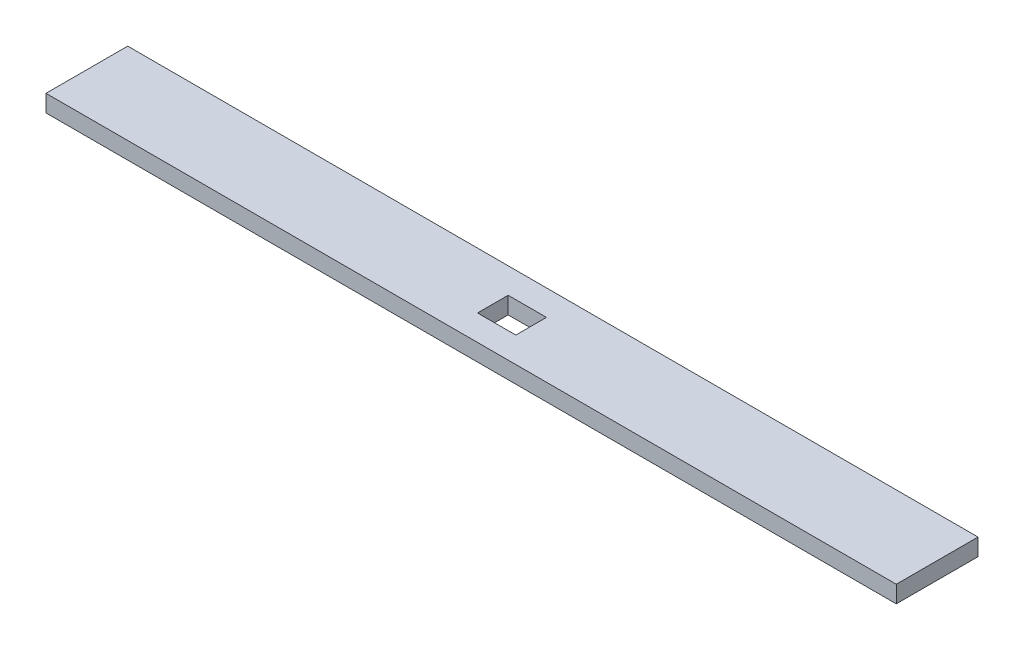
ISO-10303-21;
HEADER;
FILE_DESCRIPTION(('STEP AP214'),'2;1');
FILE_NAME('part.step','',(''),(''),'','','');
FILE_SCHEMA(('AUTOMOTIVE_DESIGN { 1 0 10303 214 1 1 1 1 }'));
ENDSEC;
DATA;
#1=APPLICATION_CONTEXT('core data for automotive mechanical design processes');
#2=APPLICATION_PROTOCOL_DEFINITION('international standard','automotive_design',2000,#1);
#3=PRODUCT_CONTEXT('',#1,'mechanical');
#4=PRODUCT('Part','Part','',(#3));
#5=PRODUCT_RELATED_PRODUCT_CATEGORY('part','',(#4));
#6=PRODUCT_DEFINITION_FORMATION('','',#4);
#7=PRODUCT_DEFINITION_CONTEXT('part definition',#1,'design');
#8=PRODUCT_DEFINITION('design','',#6,#7);
#9=PRODUCT_DEFINITION_SHAPE('','',#8);
#10=(LENGTH_UNIT() NAMED_UNIT(*) SI_UNIT(.MILLI.,.METRE.));
#11=(NAMED_UNIT(*) PLANE_ANGLE_UNIT() SI_UNIT($,.RADIAN.));
#12=(NAMED_UNIT(*) SI_UNIT($,.STERADIAN.) SOLID_ANGLE_UNIT());
#13=UNCERTAINTY_MEASURE_WITH_UNIT(LENGTH_MEASURE(1.E-05),#10,'distance_accuracy_value','');
#14=(GEOMETRIC_REPRESENTATION_CONTEXT(3) GLOBAL_UNCERTAINTY_ASSIGNED_CONTEXT((#13)) GLOBAL_UNIT_ASSIGNED_CONTEXT((#10,
#11,#12)) REPRESENTATION_CONTEXT('',''));
#15=CARTESIAN_POINT('',(0.,0.,0.));
#16=DIRECTION('',(0.,0.,1.));
#17=DIRECTION('',(1.,0.,0.));
#18=AXIS2_PLACEMENT_3D('',#15,#16,#17);
#19=CARTESIAN_POINT('',(499.5,0.,0.));
#20=DIRECTION('',(0.,0.,-1.));
#21=DIRECTION('',(-1.,0.,0.));
#22=AXIS2_PLACEMENT_3D('',#19,#20,#21);
#23=PLANE('',#22);
#24=DIRECTION('',(0.,-1.,0.));
#25=VECTOR('',#24,1.);
#26=CARTESIAN_POINT('',(0.,0.,0.));
#27=LINE('',#26,#25);
#28=CARTESIAN_POINT('',(0.,10.,0.));
#29=VERTEX_POINT('',#28);
#30=CARTESIAN_POINT('',(0.,0.,0.));
#31=VERTEX_POINT('',#30);
#32=EDGE_CURVE('E132',#29,#31,#27,.T.);
#33=ORIENTED_EDGE('',*,*,#32,.T.);
#34=DIRECTION('',(-1.,0.,0.));
#35=VECTOR('',#34,1.);
#36=CARTESIAN_POINT('',(499.5,0.,0.));
#37=LINE('',#36,#35);
#38=CARTESIAN_POINT('',(499.5,0.,0.));
#39=VERTEX_POINT('',#38);
#40=EDGE_CURVE('E11',#39,#31,#37,.T.);
#41=ORIENTED_EDGE('',*,*,#40,.F.);
#42=DIRECTION('',(0.,-1.,0.));
#43=VECTOR('',#42,1.);
#44=CARTESIAN_POINT('',(499.5,0.,0.));
#45=LINE('',#44,#43);
#46=CARTESIAN_POINT('',(499.5,10.,0.));
#47=VERTEX_POINT('',#46);
#48=EDGE_CURVE('E136',#47,#39,#45,.T.);
#49=ORIENTED_EDGE('',*,*,#48,.F.);
#50=DIRECTION('',(-1.,0.,0.));
#51=VECTOR('',#50,1.);
#52=CARTESIAN_POINT('',(499.5,10.,0.));
#53=LINE('',#52,#51);
#54=EDGE_CURVE('E146',#47,#29,#53,.T.);
#55=ORIENTED_EDGE('',*,*,#54,.T.);
#56=EDGE_LOOP('',(#33,#41,#49,#55));
#57=FACE_BOUND('',#56,.T.);
#58=ADVANCED_FACE('F35',(#57),#23,.F.);
#59=CARTESIAN_POINT('',(499.5,0.,0.));
#60=DIRECTION('',(0.,1.,0.));
#61=DIRECTION('',(0.,0.,1.));
#62=AXIS2_PLACEMENT_3D('',#59,#60,#61);
#63=PLANE('',#62);
#64=DIRECTION('',(1.,0.,0.));
#65=VECTOR('',#64,1.);
#66=CARTESIAN_POINT('',(261.,0.,-15.));
#67=LINE('',#66,#65);
#68=CARTESIAN_POINT('',(238.5,0.,-15.));
#69=VERTEX_POINT('',#68);
#70=CARTESIAN_POINT('',(261.,0.,-15.));
#71=VERTEX_POINT('',#70);
#72=EDGE_CURVE('E107',#69,#71,#67,.T.);
#73=ORIENTED_EDGE('',*,*,#72,.T.);
#74=DIRECTION('',(0.,0.,-1.));
#75=VECTOR('',#74,1.);
#76=CARTESIAN_POINT('',(261.,0.,-15.));
#77=LINE('',#76,#75);
#78=CARTESIAN_POINT('',(261.,0.,-33.));
#79=VERTEX_POINT('',#78);
#80=EDGE_CURVE('E101',#71,#79,#77,.T.);
#81=ORIENTED_EDGE('',*,*,#80,.T.);
#82=DIRECTION('',(-1.,0.,0.));
#83=VECTOR('',#82,1.);
#84=CARTESIAN_POINT('',(261.,0.,-33.));
#85=LINE('',#84,#83);
#86=CARTESIAN_POINT('',(238.5,0.,-33.));
#87=VERTEX_POINT('',#86);
#88=EDGE_CURVE('E110',#79,#87,#85,.T.);
#89=ORIENTED_EDGE('',*,*,#88,.T.);
#90=DIRECTION('',(0.,0.,1.));
#91=VECTOR('',#90,1.);
#92=CARTESIAN_POINT('',(238.5,0.,-15.));
#93=LINE('',#92,#91);
#94=EDGE_CURVE('E49',#87,#69,#93,.T.);
#95=ORIENTED_EDGE('',*,*,#94,.T.);
#96=EDGE_LOOP('',(#73,#81,#89,#95));
#97=FACE_BOUND('',#96,.T.);
#98=DIRECTION('',(0.,0.,-1.));
#99=VECTOR('',#98,1.);
#100=CARTESIAN_POINT('',(0.,0.,0.));
#101=LINE('',#100,#99);
#102=CARTESIAN_POINT('',(0.,0.,-48.));
#103=VERTEX_POINT('',#102);
#104=EDGE_CURVE('E149',#31,#103,#101,.T.);
#105=ORIENTED_EDGE('',*,*,#104,.T.);
#106=DIRECTION('',(-1.,0.,0.));
#107=VECTOR('',#106,1.);
#108=CARTESIAN_POINT('',(499.5,0.,-48.));
#109=LINE('',#108,#107);
#110=CARTESIAN_POINT('',(499.5,0.,-48.));
#111=VERTEX_POINT('',#110);
#112=EDGE_CURVE('E42',#111,#103,#109,.T.);
#113=ORIENTED_EDGE('',*,*,#112,.F.);
#114=DIRECTION('',(0.,0.,-1.));
#115=VECTOR('',#114,1.);
#116=CARTESIAN_POINT('',(499.5,0.,0.));
#117=LINE('',#116,#115);
#118=EDGE_CURVE('E139',#39,#111,#117,.T.);
#119=ORIENTED_EDGE('',*,*,#118,.F.);
#120=ORIENTED_EDGE('',*,*,#40,.T.);
#121=EDGE_LOOP('',(#105,#113,#119,#120));
#122=FACE_BOUND('',#121,.T.);
#123=ADVANCED_FACE('F114',(#97,#122),#63,.F.);
#124=CARTESIAN_POINT('',(499.5,0.,-48.));
#125=DIRECTION('',(0.,0.,1.));
#126=DIRECTION('',(1.,0.,0.));
#127=AXIS2_PLACEMENT_3D('',#124,#125,#126);
#128=PLANE('',#127);
#129=DIRECTION('',(0.,1.,0.));
#130=VECTOR('',#129,1.);
#131=CARTESIAN_POINT('',(0.,0.,-48.));
#132=LINE('',#131,#130);
#133=CARTESIAN_POINT('',(0.,10.,-48.));
#134=VERTEX_POINT('',#133);
#135=EDGE_CURVE('E151',#103,#134,#132,.T.);
#136=ORIENTED_EDGE('',*,*,#135,.T.);
#137=DIRECTION('',(-1.,0.,0.));
#138=VECTOR('',#137,1.);
#139=CARTESIAN_POINT('',(499.5,10.,-48.));
#140=LINE('',#139,#138);
#141=CARTESIAN_POINT('',(499.5,10.,-48.));
#142=VERTEX_POINT('',#141);
#143=EDGE_CURVE('E156',#142,#134,#140,.T.);
#144=ORIENTED_EDGE('',*,*,#143,.F.);
#145=DIRECTION('',(0.,1.,0.));
#146=VECTOR('',#145,1.);
#147=CARTESIAN_POINT('',(499.5,0.,-48.));
#148=LINE('',#147,#146);
#149=EDGE_CURVE('E142',#111,#142,#148,.T.);
#150=ORIENTED_EDGE('',*,*,#149,.F.);
#151=ORIENTED_EDGE('',*,*,#112,.T.);
#152=EDGE_LOOP('',(#136,#144,#150,#151));
#153=FACE_BOUND('',#152,.T.);
#154=ADVANCED_FACE('F163',(#153),#128,.F.);
#155=CARTESIAN_POINT('',(499.5,10.,0.));
#156=DIRECTION('',(0.,-1.,0.));
#157=DIRECTION('',(0.,0.,-1.));
#158=AXIS2_PLACEMENT_3D('',#155,#156,#157);
#159=PLANE('',#158);
#160=DIRECTION('',(-1.,0.,0.));
#161=VECTOR('',#160,1.);
#162=CARTESIAN_POINT('',(261.,10.,-33.));
#163=LINE('',#162,#161);
#164=CARTESIAN_POINT('',(261.,10.,-33.));
#165=VERTEX_POINT('',#164);
#166=CARTESIAN_POINT('',(238.5,10.,-33.));
#167=VERTEX_POINT('',#166);
#168=EDGE_CURVE('E126',#165,#167,#163,.T.);
#169=ORIENTED_EDGE('',*,*,#168,.F.);
#170=DIRECTION('',(0.,0.,-1.));
#171=VECTOR('',#170,1.);
#172=CARTESIAN_POINT('',(261.,10.,-15.));
#173=LINE('',#172,#171);
#174=CARTESIAN_POINT('',(261.,10.,-15.));
#175=VERTEX_POINT('',#174);
#176=EDGE_CURVE('E57',#175,#165,#173,.T.);
#177=ORIENTED_EDGE('',*,*,#176,.F.);
#178=DIRECTION('',(1.,0.,0.));
#179=VECTOR('',#178,1.);
#180=CARTESIAN_POINT('',(261.,10.,-15.));
#181=LINE('',#180,#179);
#182=CARTESIAN_POINT('',(238.5,10.,-15.));
#183=VERTEX_POINT('',#182);
#184=EDGE_CURVE('E117',#183,#175,#181,.T.);
#185=ORIENTED_EDGE('',*,*,#184,.F.);
#186=DIRECTION('',(0.,0.,1.));
#187=VECTOR('',#186,1.);
#188=CARTESIAN_POINT('',(238.5,10.,-15.));
#189=LINE('',#188,#187);
#190=EDGE_CURVE('E120',#167,#183,#189,.T.);
#191=ORIENTED_EDGE('',*,*,#190,.F.);
#192=EDGE_LOOP('',(#169,#177,#185,#191));
#193=FACE_BOUND('',#192,.T.);
#194=DIRECTION('',(0.,0.,1.));
#195=VECTOR('',#194,1.);
#196=CARTESIAN_POINT('',(0.,10.,0.));
#197=LINE('',#196,#195);
#198=EDGE_CURVE('E140',#134,#29,#197,.T.);
#199=ORIENTED_EDGE('',*,*,#198,.T.);
#200=ORIENTED_EDGE('',*,*,#54,.F.);
#201=DIRECTION('',(0.,0.,1.));
#202=VECTOR('',#201,1.);
#203=CARTESIAN_POINT('',(499.5,10.,0.));
#204=LINE('',#203,#202);
#205=EDGE_CURVE('E144',#142,#47,#204,.T.);
#206=ORIENTED_EDGE('',*,*,#205,.F.);
#207=ORIENTED_EDGE('',*,*,#143,.T.);
#208=EDGE_LOOP('',(#199,#200,#206,#207));
#209=FACE_BOUND('',#208,.T.);
#210=ADVANCED_FACE('F171',(#193,#209),#159,.F.);
#211=CARTESIAN_POINT('',(499.5,0.,0.));
#212=DIRECTION('',(-1.,0.,0.));
#213=DIRECTION('',(0.,0.,1.));
#214=AXIS2_PLACEMENT_3D('',#211,#212,#213);
#215=PLANE('',#214);
#216=ORIENTED_EDGE('',*,*,#48,.T.);
#217=ORIENTED_EDGE('',*,*,#118,.T.);
#218=ORIENTED_EDGE('',*,*,#149,.T.);
#219=ORIENTED_EDGE('',*,*,#205,.T.);
#220=EDGE_LOOP('',(#216,#217,#218,#219));
#221=FACE_BOUND('',#220,.T.);
#222=ADVANCED_FACE('F177',(#221),#215,.F.);
#223=CARTESIAN_POINT('',(0.,0.,0.));
#224=DIRECTION('',(-1.,0.,0.));
#225=DIRECTION('',(0.,0.,1.));
#226=AXIS2_PLACEMENT_3D('',#223,#224,#225);
#227=PLANE('',#226);
#228=ORIENTED_EDGE('',*,*,#32,.F.);
#229=ORIENTED_EDGE('',*,*,#198,.F.);
#230=ORIENTED_EDGE('',*,*,#135,.F.);
#231=ORIENTED_EDGE('',*,*,#104,.F.);
#232=EDGE_LOOP('',(#228,#229,#230,#231));
#233=FACE_BOUND('',#232,.T.);
#234=ADVANCED_FACE('F168',(#233),#227,.T.);
#235=CARTESIAN_POINT('',(261.,0.,-15.));
#236=DIRECTION('',(1.,0.,0.));
#237=DIRECTION('',(0.,0.,-1.));
#238=AXIS2_PLACEMENT_3D('',#235,#236,#237);
#239=PLANE('',#238);
#240=ORIENTED_EDGE('',*,*,#176,.T.);
#241=DIRECTION('',(0.,1.,0.));
#242=VECTOR('',#241,1.);
#243=CARTESIAN_POINT('',(261.,0.,-33.));
#244=LINE('',#243,#242);
#245=EDGE_CURVE('E97',#79,#165,#244,.T.);
#246=ORIENTED_EDGE('',*,*,#245,.F.);
#247=ORIENTED_EDGE('',*,*,#80,.F.);
#248=DIRECTION('',(0.,1.,0.));
#249=VECTOR('',#248,1.);
#250=CARTESIAN_POINT('',(261.,0.,-15.));
#251=LINE('',#250,#249);
#252=EDGE_CURVE('E130',#71,#175,#251,.T.);
#253=ORIENTED_EDGE('',*,*,#252,.T.);
#254=EDGE_LOOP('',(#240,#246,#247,#253));
#255=FACE_BOUND('',#254,.T.);
#256=ADVANCED_FACE('F99',(#255),#239,.F.);
#257=CARTESIAN_POINT('',(261.,0.,-15.));
#258=DIRECTION('',(0.,0.,1.));
#259=DIRECTION('',(1.,0.,0.));
#260=AXIS2_PLACEMENT_3D('',#257,#258,#259);
#261=PLANE('',#260);
#262=ORIENTED_EDGE('',*,*,#184,.T.);
#263=ORIENTED_EDGE('',*,*,#252,.F.);
#264=ORIENTED_EDGE('',*,*,#72,.F.);
#265=DIRECTION('',(0.,1.,0.));
#266=VECTOR('',#265,1.);
#267=CARTESIAN_POINT('',(238.5,0.,-15.));
#268=LINE('',#267,#266);
#269=EDGE_CURVE('E133',#69,#183,#268,.T.);
#270=ORIENTED_EDGE('',*,*,#269,.T.);
#271=EDGE_LOOP('',(#262,#263,#264,#270));
#272=FACE_BOUND('',#271,.T.);
#273=ADVANCED_FACE('F194',(#272),#261,.F.);
#274=CARTESIAN_POINT('',(238.5,0.,-15.));
#275=DIRECTION('',(-1.,0.,0.));
#276=DIRECTION('',(0.,0.,1.));
#277=AXIS2_PLACEMENT_3D('',#274,#275,#276);
#278=PLANE('',#277);
#279=ORIENTED_EDGE('',*,*,#190,.T.);
#280=ORIENTED_EDGE('',*,*,#269,.F.);
#281=ORIENTED_EDGE('',*,*,#94,.F.);
#282=DIRECTION('',(0.,1.,0.));
#283=VECTOR('',#282,1.);
#284=CARTESIAN_POINT('',(238.5,0.,-33.));
#285=LINE('',#284,#283);
#286=EDGE_CURVE('E106',#87,#167,#285,.T.);
#287=ORIENTED_EDGE('',*,*,#286,.T.);
#288=EDGE_LOOP('',(#279,#280,#281,#287));
#289=FACE_BOUND('',#288,.T.);
#290=ADVANCED_FACE('F197',(#289),#278,.F.);
#291=CARTESIAN_POINT('',(261.,0.,-33.));
#292=DIRECTION('',(0.,0.,-1.));
#293=DIRECTION('',(-1.,0.,0.));
#294=AXIS2_PLACEMENT_3D('',#291,#292,#293);
#295=PLANE('',#294);
#296=ORIENTED_EDGE('',*,*,#168,.T.);
#297=ORIENTED_EDGE('',*,*,#286,.F.);
#298=ORIENTED_EDGE('',*,*,#88,.F.);
#299=ORIENTED_EDGE('',*,*,#245,.T.);
#300=EDGE_LOOP('',(#296,#297,#298,#299));
#301=FACE_BOUND('',#300,.T.);
#302=ADVANCED_FACE('F111',(#301),#295,.F.);
#303=CLOSED_SHELL('',(#58,#123,#154,#210,#222,#234,#256,#273,#290,#302));
#304=MANIFOLD_SOLID_BREP('B2',#303);
#305=ADVANCED_BREP_SHAPE_REPRESENTATION('',(#18,#304),#14);
#306=SHAPE_DEFINITION_REPRESENTATION(#9,#305);
ENDSEC;
END-ISO-10303-21;
